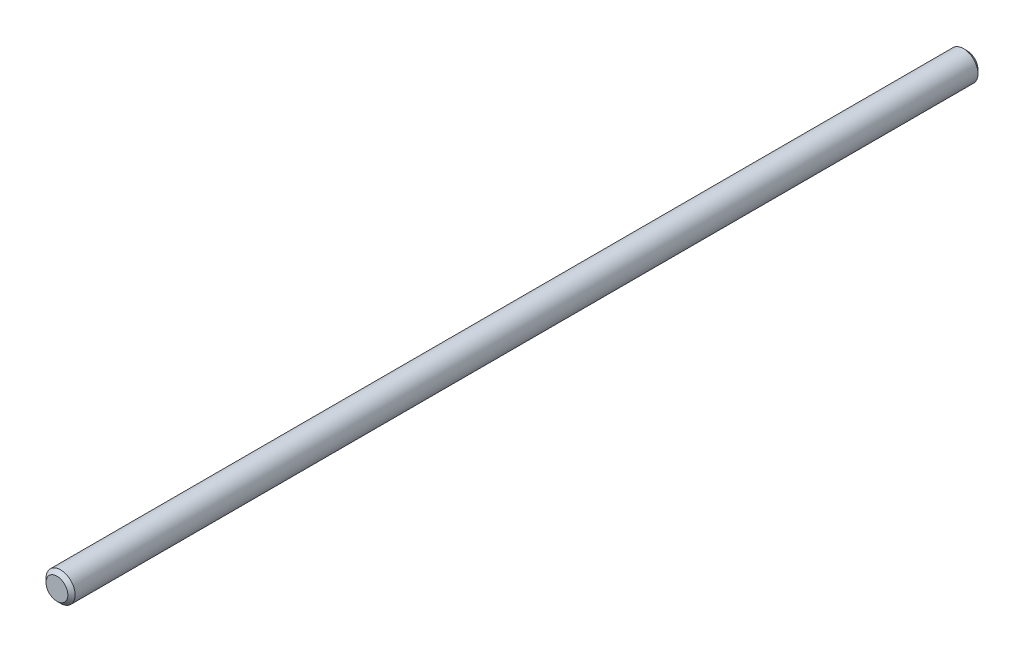
ISO-10303-21;
HEADER;
FILE_DESCRIPTION(('STEP AP214'),'2;1');
FILE_NAME('part.step','',(''),(''),'','','');
FILE_SCHEMA(('AUTOMOTIVE_DESIGN { 1 0 10303 214 1 1 1 1 }'));
ENDSEC;
DATA;
#1=APPLICATION_CONTEXT('core data for automotive mechanical design processes');
#2=APPLICATION_PROTOCOL_DEFINITION('international standard','automotive_design',2000,#1);
#3=PRODUCT_CONTEXT('',#1,'mechanical');
#4=PRODUCT('Part','Part','',(#3));
#5=PRODUCT_RELATED_PRODUCT_CATEGORY('part','',(#4));
#6=PRODUCT_DEFINITION_FORMATION('','',#4);
#7=PRODUCT_DEFINITION_CONTEXT('part definition',#1,'design');
#8=PRODUCT_DEFINITION('design','',#6,#7);
#9=PRODUCT_DEFINITION_SHAPE('','',#8);
#10=(LENGTH_UNIT() NAMED_UNIT(*) SI_UNIT(.MILLI.,.METRE.));
#11=(NAMED_UNIT(*) PLANE_ANGLE_UNIT() SI_UNIT($,.RADIAN.));
#12=(NAMED_UNIT(*) SI_UNIT($,.STERADIAN.) SOLID_ANGLE_UNIT());
#13=UNCERTAINTY_MEASURE_WITH_UNIT(LENGTH_MEASURE(1.E-05),#10,'distance_accuracy_value','');
#14=(GEOMETRIC_REPRESENTATION_CONTEXT(3) GLOBAL_UNCERTAINTY_ASSIGNED_CONTEXT((#13)) GLOBAL_UNIT_ASSIGNED_CONTEXT((#10,
#11,#12)) REPRESENTATION_CONTEXT('',''));
#15=CARTESIAN_POINT('',(0.,0.,0.));
#16=DIRECTION('',(0.,0.,1.));
#17=DIRECTION('',(1.,0.,0.));
#18=AXIS2_PLACEMENT_3D('',#15,#16,#17);
#19=CARTESIAN_POINT('',(0.,0.,250.));
#20=DIRECTION('',(0.,0.,-1.));
#21=DIRECTION('',(-1.,0.,0.));
#22=AXIS2_PLACEMENT_3D('',#19,#20,#21);
#23=CYLINDRICAL_SURFACE('',#22,4.);
#24=CARTESIAN_POINT('',(0.,0.,249.));
#25=DIRECTION('',(0.,0.,1.));
#26=DIRECTION('',(1.,0.,0.));
#27=AXIS2_PLACEMENT_3D('',#24,#25,#26);
#28=CIRCLE('',#27,4.);
#29=CARTESIAN_POINT('',(4.,0.,249.));
#30=VERTEX_POINT('',#29);
#31=EDGE_CURVE('E38',#30,#30,#28,.F.);
#32=ORIENTED_EDGE('',*,*,#31,.T.);
#33=EDGE_LOOP('',(#32));
#34=FACE_BOUND('',#33,.T.);
#35=CARTESIAN_POINT('',(0.,0.,1.));
#36=DIRECTION('',(0.,0.,1.));
#37=DIRECTION('',(1.,0.,0.));
#38=AXIS2_PLACEMENT_3D('',#35,#36,#37);
#39=CIRCLE('',#38,4.);
#40=CARTESIAN_POINT('',(4.,0.,1.));
#41=VERTEX_POINT('',#40);
#42=EDGE_CURVE('E42',#41,#41,#39,.T.);
#43=ORIENTED_EDGE('',*,*,#42,.T.);
#44=EDGE_LOOP('',(#43));
#45=FACE_BOUND('',#44,.T.);
#46=ADVANCED_FACE('F31',(#34,#45),#23,.T.);
#47=CARTESIAN_POINT('',(0.,0.,250.));
#48=DIRECTION('',(0.,0.,1.));
#49=DIRECTION('',(1.,0.,0.));
#50=AXIS2_PLACEMENT_3D('',#47,#48,#49);
#51=PLANE('',#50);
#52=CARTESIAN_POINT('',(0.,0.,250.));
#53=DIRECTION('',(0.,0.,1.));
#54=DIRECTION('',(1.,0.,0.));
#55=AXIS2_PLACEMENT_3D('',#52,#53,#54);
#56=CIRCLE('',#55,2.99999999999998);
#57=CARTESIAN_POINT('',(2.99999999999998,0.,250.));
#58=VERTEX_POINT('',#57);
#59=EDGE_CURVE('E46',#58,#58,#56,.T.);
#60=ORIENTED_EDGE('',*,*,#59,.T.);
#61=EDGE_LOOP('',(#60));
#62=FACE_BOUND('',#61,.T.);
#63=ADVANCED_FACE('F52',(#62),#51,.T.);
#64=CARTESIAN_POINT('',(0.,0.,0.));
#65=DIRECTION('',(0.,0.,1.));
#66=DIRECTION('',(1.,0.,0.));
#67=AXIS2_PLACEMENT_3D('',#64,#65,#66);
#68=PLANE('',#67);
#69=CARTESIAN_POINT('',(0.,0.,0.));
#70=DIRECTION('',(0.,0.,1.));
#71=DIRECTION('',(1.,0.,0.));
#72=AXIS2_PLACEMENT_3D('',#69,#70,#71);
#73=CIRCLE('',#72,2.99999999999998);
#74=CARTESIAN_POINT('',(2.99999999999998,0.,0.));
#75=VERTEX_POINT('',#74);
#76=EDGE_CURVE('E10',#75,#75,#73,.F.);
#77=ORIENTED_EDGE('',*,*,#76,.T.);
#78=EDGE_LOOP('',(#77));
#79=FACE_BOUND('',#78,.T.);
#80=ADVANCED_FACE('F56',(#79),#68,.F.);
#81=CARTESIAN_POINT('',(0.,0.,250.));
#82=DIRECTION('',(0.,0.,-1.));
#83=DIRECTION('',(-1.,0.,0.));
#84=AXIS2_PLACEMENT_3D('',#81,#82,#83);
#85=CONICAL_SURFACE('',#84,2.99999999999998,0.78539816339746);
#86=ORIENTED_EDGE('',*,*,#31,.F.);
#87=EDGE_LOOP('',(#86));
#88=FACE_BOUND('',#87,.T.);
#89=ORIENTED_EDGE('',*,*,#59,.F.);
#90=EDGE_LOOP('',(#89));
#91=FACE_BOUND('',#90,.T.);
#92=ADVANCED_FACE('F54',(#88,#91),#85,.T.);
#93=CARTESIAN_POINT('',(0.,0.,1.));
#94=DIRECTION('',(0.,0.,1.));
#95=DIRECTION('',(1.,0.,0.));
#96=AXIS2_PLACEMENT_3D('',#93,#94,#95);
#97=CONICAL_SURFACE('',#96,4.,0.78539816339746);
#98=ORIENTED_EDGE('',*,*,#76,.F.);
#99=EDGE_LOOP('',(#98));
#100=FACE_BOUND('',#99,.T.);
#101=ORIENTED_EDGE('',*,*,#42,.F.);
#102=EDGE_LOOP('',(#101));
#103=FACE_BOUND('',#102,.T.);
#104=ADVANCED_FACE('F33',(#100,#103),#97,.T.);
#105=CLOSED_SHELL('',(#46,#63,#80,#92,#104));
#106=MANIFOLD_SOLID_BREP('B2',#105);
#107=ADVANCED_BREP_SHAPE_REPRESENTATION('',(#18,#106),#14);
#108=SHAPE_DEFINITION_REPRESENTATION(#9,#107);
ENDSEC;
END-ISO-10303-21;
